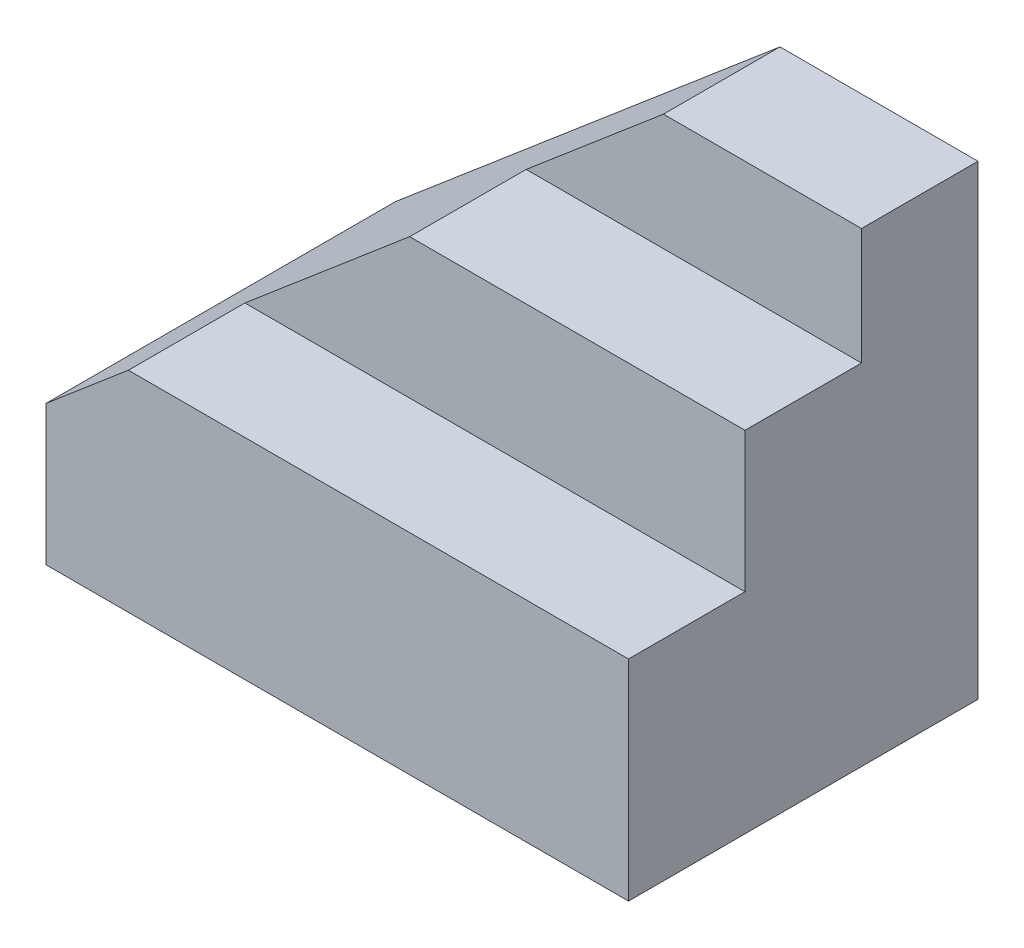
ISO-10303-21;
HEADER;
FILE_DESCRIPTION(('STEP AP214'),'2;1');
FILE_NAME('part.step','',(''),(''),'','','');
FILE_SCHEMA(('AUTOMOTIVE_DESIGN { 1 0 10303 214 1 1 1 1 }'));
ENDSEC;
DATA;
#1=APPLICATION_CONTEXT('core data for automotive mechanical design processes');
#2=APPLICATION_PROTOCOL_DEFINITION('international standard','automotive_design',2000,#1);
#3=PRODUCT_CONTEXT('',#1,'mechanical');
#4=PRODUCT('Part','Part','',(#3));
#5=PRODUCT_RELATED_PRODUCT_CATEGORY('part','',(#4));
#6=PRODUCT_DEFINITION_FORMATION('','',#4);
#7=PRODUCT_DEFINITION_CONTEXT('part definition',#1,'design');
#8=PRODUCT_DEFINITION('design','',#6,#7);
#9=PRODUCT_DEFINITION_SHAPE('','',#8);
#10=(LENGTH_UNIT() NAMED_UNIT(*) SI_UNIT(.MILLI.,.METRE.));
#11=(NAMED_UNIT(*) PLANE_ANGLE_UNIT() SI_UNIT($,.RADIAN.));
#12=(NAMED_UNIT(*) SI_UNIT($,.STERADIAN.) SOLID_ANGLE_UNIT());
#13=UNCERTAINTY_MEASURE_WITH_UNIT(LENGTH_MEASURE(1.E-05),#10,'distance_accuracy_value','');
#14=(GEOMETRIC_REPRESENTATION_CONTEXT(3) GLOBAL_UNCERTAINTY_ASSIGNED_CONTEXT((#13)) GLOBAL_UNIT_ASSIGNED_CONTEXT((#10,
#11,#12)) REPRESENTATION_CONTEXT('',''));
#15=CARTESIAN_POINT('',(0.,0.,0.));
#16=DIRECTION('',(0.,0.,1.));
#17=DIRECTION('',(1.,0.,0.));
#18=AXIS2_PLACEMENT_3D('',#15,#16,#17);
#19=CARTESIAN_POINT('',(0.,0.,40.));
#20=DIRECTION('',(0.,0.,1.));
#21=DIRECTION('',(1.,0.,0.));
#22=AXIS2_PLACEMENT_3D('',#19,#20,#21);
#23=PLANE('',#22);
#24=DIRECTION('',(-0.762509135372792,-0.646977448195096,0.));
#25=VECTOR('',#24,1.);
#26=CARTESIAN_POINT('',(42.4285714285714,60.,40.));
#27=LINE('',#26,#25);
#28=CARTESIAN_POINT('',(42.4285714285714,60.,40.));
#29=VERTEX_POINT('',#28);
#30=CARTESIAN_POINT('',(14.1428571428571,36.,40.));
#31=VERTEX_POINT('',#30);
#32=EDGE_CURVE('E578',#29,#31,#27,.T.);
#33=ORIENTED_EDGE('',*,*,#32,.T.);
#34=DIRECTION('',(-1.,0.,0.));
#35=VECTOR('',#34,1.);
#36=CARTESIAN_POINT('',(100.,36.,40.));
#37=LINE('',#36,#35);
#38=CARTESIAN_POINT('',(100.,36.,40.));
#39=VERTEX_POINT('',#38);
#40=EDGE_CURVE('E393',#39,#31,#37,.T.);
#41=ORIENTED_EDGE('',*,*,#40,.F.);
#42=DIRECTION('',(0.,1.,0.));
#43=VECTOR('',#42,1.);
#44=CARTESIAN_POINT('',(100.,0.,40.));
#45=LINE('',#44,#43);
#46=CARTESIAN_POINT('',(100.,60.,40.));
#47=VERTEX_POINT('',#46);
#48=EDGE_CURVE('E269',#39,#47,#45,.T.);
#49=ORIENTED_EDGE('',*,*,#48,.T.);
#50=DIRECTION('',(-1.,0.,0.));
#51=VECTOR('',#50,1.);
#52=CARTESIAN_POINT('',(100.,60.,40.));
#53=LINE('',#52,#51);
#54=EDGE_CURVE('E682',#47,#29,#53,.T.);
#55=ORIENTED_EDGE('',*,*,#54,.T.);
#56=EDGE_LOOP('',(#33,#41,#49,#55));
#57=FACE_BOUND('',#56,.T.);
#58=ADVANCED_FACE('F75',(#57),#23,.T.);
#59=CARTESIAN_POINT('',(0.,0.,20.));
#60=DIRECTION('',(0.,0.,1.));
#61=DIRECTION('',(1.,0.,0.));
#62=AXIS2_PLACEMENT_3D('',#59,#60,#61);
#63=PLANE('',#62);
#64=DIRECTION('',(-0.762509135372792,-0.646977448195096,0.));
#65=VECTOR('',#64,1.);
#66=CARTESIAN_POINT('',(66.,80.,20.));
#67=LINE('',#66,#65);
#68=CARTESIAN_POINT('',(66.,80.,20.));
#69=VERTEX_POINT('',#68);
#70=CARTESIAN_POINT('',(42.4285714285714,60.,20.));
#71=VERTEX_POINT('',#70);
#72=EDGE_CURVE('E12',#69,#71,#67,.T.);
#73=ORIENTED_EDGE('',*,*,#72,.T.);
#74=DIRECTION('',(-1.,0.,0.));
#75=VECTOR('',#74,1.);
#76=CARTESIAN_POINT('',(100.,60.,20.));
#77=LINE('',#76,#75);
#78=CARTESIAN_POINT('',(100.,60.,20.));
#79=VERTEX_POINT('',#78);
#80=EDGE_CURVE('E453',#79,#71,#77,.T.);
#81=ORIENTED_EDGE('',*,*,#80,.F.);
#82=DIRECTION('',(0.,1.,0.));
#83=VECTOR('',#82,1.);
#84=CARTESIAN_POINT('',(100.,0.,20.));
#85=LINE('',#84,#83);
#86=CARTESIAN_POINT('',(100.,80.,20.));
#87=VERTEX_POINT('',#86);
#88=EDGE_CURVE('E464',#79,#87,#85,.T.);
#89=ORIENTED_EDGE('',*,*,#88,.T.);
#90=DIRECTION('',(-1.,0.,0.));
#91=VECTOR('',#90,1.);
#92=CARTESIAN_POINT('',(100.,80.,20.));
#93=LINE('',#92,#91);
#94=EDGE_CURVE('E87',#87,#69,#93,.T.);
#95=ORIENTED_EDGE('',*,*,#94,.T.);
#96=EDGE_LOOP('',(#73,#81,#89,#95));
#97=FACE_BOUND('',#96,.T.);
#98=ADVANCED_FACE('F77',(#97),#63,.T.);
#99=CARTESIAN_POINT('',(0.,0.,0.));
#100=DIRECTION('',(0.,0.,1.));
#101=DIRECTION('',(1.,0.,0.));
#102=AXIS2_PLACEMENT_3D('',#99,#100,#101);
#103=PLANE('',#102);
#104=DIRECTION('',(0.,-1.,0.));
#105=VECTOR('',#104,1.);
#106=CARTESIAN_POINT('',(0.,24.,0.));
#107=LINE('',#106,#105);
#108=CARTESIAN_POINT('',(0.,24.,0.));
#109=VERTEX_POINT('',#108);
#110=CARTESIAN_POINT('',(0.,0.,0.));
#111=VERTEX_POINT('',#110);
#112=EDGE_CURVE('E562',#109,#111,#107,.T.);
#113=ORIENTED_EDGE('',*,*,#112,.F.);
#114=DIRECTION('',(-0.762509135372792,-0.646977448195096,0.));
#115=VECTOR('',#114,1.);
#116=CARTESIAN_POINT('',(66.,80.,0.));
#117=LINE('',#116,#115);
#118=CARTESIAN_POINT('',(66.,80.,0.));
#119=VERTEX_POINT('',#118);
#120=EDGE_CURVE('E526',#119,#109,#117,.T.);
#121=ORIENTED_EDGE('',*,*,#120,.F.);
#122=DIRECTION('',(-1.,0.,0.));
#123=VECTOR('',#122,1.);
#124=CARTESIAN_POINT('',(100.,80.,0.));
#125=LINE('',#124,#123);
#126=CARTESIAN_POINT('',(100.,80.,0.));
#127=VERTEX_POINT('',#126);
#128=EDGE_CURVE('E539',#127,#119,#125,.T.);
#129=ORIENTED_EDGE('',*,*,#128,.F.);
#130=DIRECTION('',(0.,1.,0.));
#131=VECTOR('',#130,1.);
#132=CARTESIAN_POINT('',(100.,0.,0.));
#133=LINE('',#132,#131);
#134=CARTESIAN_POINT('',(100.,0.,0.));
#135=VERTEX_POINT('',#134);
#136=EDGE_CURVE('E497',#135,#127,#133,.T.);
#137=ORIENTED_EDGE('',*,*,#136,.F.);
#138=DIRECTION('',(1.,0.,0.));
#139=VECTOR('',#138,1.);
#140=CARTESIAN_POINT('',(0.,0.,0.));
#141=LINE('',#140,#139);
#142=EDGE_CURVE('E556',#111,#135,#141,.T.);
#143=ORIENTED_EDGE('',*,*,#142,.F.);
#144=EDGE_LOOP('',(#113,#121,#129,#137,#143));
#145=FACE_BOUND('',#144,.T.);
#146=ADVANCED_FACE('F583',(#145),#103,.F.);
#147=CARTESIAN_POINT('',(0.,0.,0.));
#148=DIRECTION('',(0.,1.,0.));
#149=DIRECTION('',(0.,0.,1.));
#150=AXIS2_PLACEMENT_3D('',#147,#148,#149);
#151=PLANE('',#150);
#152=CARTESIAN_POINT('',(100.,0.,0.));
#153=DIRECTION('',(0.,0.,1.));
#154=VECTOR('',#153,1.);
#155=LINE('',#152,#154);
#156=CARTESIAN_POINT('',(100.,0.,20.));
#157=VERTEX_POINT('',#156);
#158=EDGE_CURVE('E557',#135,#157,#155,.T.);
#159=ORIENTED_EDGE('',*,*,#158,.T.);
#160=CARTESIAN_POINT('',(100.,0.,20.));
#161=DIRECTION('',(0.,0.,1.));
#162=VECTOR('',#161,1.);
#163=LINE('',#160,#162);
#164=CARTESIAN_POINT('',(100.,0.,40.));
#165=VERTEX_POINT('',#164);
#166=EDGE_CURVE('E196',#157,#165,#163,.T.);
#167=ORIENTED_EDGE('',*,*,#166,.T.);
#168=CARTESIAN_POINT('',(100.,0.,40.));
#169=DIRECTION('',(0.,0.,1.));
#170=VECTOR('',#169,1.);
#171=LINE('',#168,#170);
#172=CARTESIAN_POINT('',(100.,0.,60.));
#173=VERTEX_POINT('',#172);
#174=EDGE_CURVE('E188',#165,#173,#171,.T.);
#175=ORIENTED_EDGE('',*,*,#174,.T.);
#176=DIRECTION('',(1.,0.,0.));
#177=VECTOR('',#176,1.);
#178=CARTESIAN_POINT('',(0.,0.,60.));
#179=LINE('',#178,#177);
#180=CARTESIAN_POINT('',(0.,0.,60.));
#181=VERTEX_POINT('',#180);
#182=EDGE_CURVE('E182',#181,#173,#179,.T.);
#183=ORIENTED_EDGE('',*,*,#182,.F.);
#184=CARTESIAN_POINT('',(0.,0.,40.));
#185=DIRECTION('',(0.,0.,1.));
#186=VECTOR('',#185,1.);
#187=LINE('',#184,#186);
#188=CARTESIAN_POINT('',(0.,0.,40.));
#189=VERTEX_POINT('',#188);
#190=EDGE_CURVE('E171',#189,#181,#187,.T.);
#191=ORIENTED_EDGE('',*,*,#190,.F.);
#192=CARTESIAN_POINT('',(0.,0.,20.));
#193=DIRECTION('',(0.,0.,1.));
#194=VECTOR('',#193,1.);
#195=LINE('',#192,#194);
#196=CARTESIAN_POINT('',(0.,0.,20.));
#197=VERTEX_POINT('',#196);
#198=EDGE_CURVE('E177',#197,#189,#195,.T.);
#199=ORIENTED_EDGE('',*,*,#198,.F.);
#200=CARTESIAN_POINT('',(0.,0.,0.));
#201=DIRECTION('',(0.,0.,1.));
#202=VECTOR('',#201,1.);
#203=LINE('',#200,#202);
#204=EDGE_CURVE('E194',#111,#197,#203,.T.);
#205=ORIENTED_EDGE('',*,*,#204,.F.);
#206=ORIENTED_EDGE('',*,*,#142,.T.);
#207=EDGE_LOOP('',(#159,#167,#175,#183,#191,#199,#205,#206));
#208=FACE_BOUND('',#207,.T.);
#209=ADVANCED_FACE('F175',(#208),#151,.F.);
#210=CARTESIAN_POINT('',(0.,0.,0.));
#211=DIRECTION('',(1.,0.,0.));
#212=DIRECTION('',(0.,0.,-1.));
#213=AXIS2_PLACEMENT_3D('',#210,#211,#212);
#214=PLANE('',#213);
#215=ORIENTED_EDGE('',*,*,#204,.T.);
#216=ORIENTED_EDGE('',*,*,#198,.T.);
#217=ORIENTED_EDGE('',*,*,#190,.T.);
#218=DIRECTION('',(0.,-1.,0.));
#219=VECTOR('',#218,1.);
#220=CARTESIAN_POINT('',(0.,24.,60.));
#221=LINE('',#220,#219);
#222=CARTESIAN_POINT('',(0.,24.,60.));
#223=VERTEX_POINT('',#222);
#224=EDGE_CURVE('E259',#223,#181,#221,.T.);
#225=ORIENTED_EDGE('',*,*,#224,.F.);
#226=CARTESIAN_POINT('',(0.,24.,40.));
#227=DIRECTION('',(0.,0.,1.));
#228=VECTOR('',#227,1.);
#229=LINE('',#226,#228);
#230=CARTESIAN_POINT('',(0.,24.,40.));
#231=VERTEX_POINT('',#230);
#232=EDGE_CURVE('E255',#231,#223,#229,.T.);
#233=ORIENTED_EDGE('',*,*,#232,.F.);
#234=CARTESIAN_POINT('',(0.,24.,20.));
#235=DIRECTION('',(0.,0.,1.));
#236=VECTOR('',#235,1.);
#237=LINE('',#234,#236);
#238=CARTESIAN_POINT('',(0.,24.,20.));
#239=VERTEX_POINT('',#238);
#240=EDGE_CURVE('E257',#239,#231,#237,.T.);
#241=ORIENTED_EDGE('',*,*,#240,.F.);
#242=CARTESIAN_POINT('',(0.,24.,0.));
#243=DIRECTION('',(0.,0.,1.));
#244=VECTOR('',#243,1.);
#245=LINE('',#242,#244);
#246=EDGE_CURVE('E267',#109,#239,#245,.T.);
#247=ORIENTED_EDGE('',*,*,#246,.F.);
#248=ORIENTED_EDGE('',*,*,#112,.T.);
#249=EDGE_LOOP('',(#215,#216,#217,#225,#233,#241,#247,#248));
#250=FACE_BOUND('',#249,.T.);
#251=ADVANCED_FACE('F192',(#250),#214,.F.);
#252=CARTESIAN_POINT('',(100.,0.,0.));
#253=DIRECTION('',(-1.,0.,0.));
#254=DIRECTION('',(0.,0.,1.));
#255=AXIS2_PLACEMENT_3D('',#252,#253,#254);
#256=PLANE('',#255);
#257=CARTESIAN_POINT('',(100.,80.,0.));
#258=DIRECTION('',(0.,0.,1.));
#259=VECTOR('',#258,1.);
#260=LINE('',#257,#259);
#261=EDGE_CURVE('E487',#127,#87,#260,.T.);
#262=ORIENTED_EDGE('',*,*,#261,.T.);
#263=ORIENTED_EDGE('',*,*,#88,.F.);
#264=CARTESIAN_POINT('',(100.,60.,20.));
#265=DIRECTION('',(0.,0.,1.));
#266=VECTOR('',#265,1.);
#267=LINE('',#264,#266);
#268=EDGE_CURVE('E104',#79,#47,#267,.T.);
#269=ORIENTED_EDGE('',*,*,#268,.T.);
#270=ORIENTED_EDGE('',*,*,#48,.F.);
#271=CARTESIAN_POINT('',(100.,36.,40.));
#272=DIRECTION('',(0.,0.,1.));
#273=VECTOR('',#272,1.);
#274=LINE('',#271,#273);
#275=CARTESIAN_POINT('',(100.,36.,60.));
#276=VERTEX_POINT('',#275);
#277=EDGE_CURVE('E95',#39,#276,#274,.T.);
#278=ORIENTED_EDGE('',*,*,#277,.T.);
#279=DIRECTION('',(0.,1.,0.));
#280=VECTOR('',#279,1.);
#281=CARTESIAN_POINT('',(100.,0.,60.));
#282=LINE('',#281,#280);
#283=EDGE_CURVE('E358',#173,#276,#282,.T.);
#284=ORIENTED_EDGE('',*,*,#283,.F.);
#285=ORIENTED_EDGE('',*,*,#174,.F.);
#286=ORIENTED_EDGE('',*,*,#166,.F.);
#287=ORIENTED_EDGE('',*,*,#158,.F.);
#288=ORIENTED_EDGE('',*,*,#136,.T.);
#289=EDGE_LOOP('',(#262,#263,#269,#270,#278,#284,#285,#286,#287,#288));
#290=FACE_BOUND('',#289,.T.);
#291=ADVANCED_FACE('F214',(#290),#256,.F.);
#292=CARTESIAN_POINT('',(0.,80.,0.));
#293=DIRECTION('',(0.,-1.,0.));
#294=DIRECTION('',(0.,0.,-1.));
#295=AXIS2_PLACEMENT_3D('',#292,#293,#294);
#296=PLANE('',#295);
#297=CARTESIAN_POINT('',(66.,80.,0.));
#298=DIRECTION('',(0.,0.,1.));
#299=VECTOR('',#298,1.);
#300=LINE('',#297,#299);
#301=EDGE_CURVE('E490',#119,#69,#300,.T.);
#302=ORIENTED_EDGE('',*,*,#301,.T.);
#303=ORIENTED_EDGE('',*,*,#94,.F.);
#304=ORIENTED_EDGE('',*,*,#261,.F.);
#305=ORIENTED_EDGE('',*,*,#128,.T.);
#306=EDGE_LOOP('',(#302,#303,#304,#305));
#307=FACE_BOUND('',#306,.T.);
#308=ADVANCED_FACE('F287',(#307),#296,.F.);
#309=CARTESIAN_POINT('',(-11.8398291510945,13.9540843566471,0.));
#310=DIRECTION('',(0.646977448195096,-0.762509135372792,0.));
#311=DIRECTION('',(0.762509135372792,0.646977448195096,0.));
#312=AXIS2_PLACEMENT_3D('',#309,#310,#311);
#313=PLANE('',#312);
#314=ORIENTED_EDGE('',*,*,#246,.T.);
#315=ORIENTED_EDGE('',*,*,#240,.T.);
#316=ORIENTED_EDGE('',*,*,#232,.T.);
#317=DIRECTION('',(-0.762509135372792,-0.646977448195096,0.));
#318=VECTOR('',#317,1.);
#319=CARTESIAN_POINT('',(14.1428571428571,36.,60.));
#320=LINE('',#319,#318);
#321=CARTESIAN_POINT('',(14.1428571428571,36.,60.));
#322=VERTEX_POINT('',#321);
#323=EDGE_CURVE('E448',#322,#223,#320,.T.);
#324=ORIENTED_EDGE('',*,*,#323,.F.);
#325=CARTESIAN_POINT('',(14.1428571428571,36.,40.));
#326=DIRECTION('',(0.,0.,1.));
#327=VECTOR('',#326,1.);
#328=LINE('',#325,#327);
#329=EDGE_CURVE('E263',#31,#322,#328,.T.);
#330=ORIENTED_EDGE('',*,*,#329,.F.);
#331=ORIENTED_EDGE('',*,*,#32,.F.);
#332=CARTESIAN_POINT('',(42.4285714285714,60.,20.));
#333=DIRECTION('',(0.,0.,1.));
#334=VECTOR('',#333,1.);
#335=LINE('',#332,#334);
#336=EDGE_CURVE('E270',#71,#29,#335,.T.);
#337=ORIENTED_EDGE('',*,*,#336,.F.);
#338=ORIENTED_EDGE('',*,*,#72,.F.);
#339=ORIENTED_EDGE('',*,*,#301,.F.);
#340=ORIENTED_EDGE('',*,*,#120,.T.);
#341=EDGE_LOOP('',(#314,#315,#316,#324,#330,#331,#337,#338,#339,#340));
#342=FACE_BOUND('',#341,.T.);
#343=ADVANCED_FACE('F265',(#342),#313,.F.);
#344=CARTESIAN_POINT('',(0.,60.,0.));
#345=DIRECTION('',(0.,-1.,0.));
#346=DIRECTION('',(0.,0.,-1.));
#347=AXIS2_PLACEMENT_3D('',#344,#345,#346);
#348=PLANE('',#347);
#349=ORIENTED_EDGE('',*,*,#336,.T.);
#350=ORIENTED_EDGE('',*,*,#54,.F.);
#351=ORIENTED_EDGE('',*,*,#268,.F.);
#352=ORIENTED_EDGE('',*,*,#80,.T.);
#353=EDGE_LOOP('',(#349,#350,#351,#352));
#354=FACE_BOUND('',#353,.T.);
#355=ADVANCED_FACE('F286',(#354),#348,.F.);
#356=CARTESIAN_POINT('',(0.,0.,60.));
#357=DIRECTION('',(0.,0.,1.));
#358=DIRECTION('',(1.,0.,0.));
#359=AXIS2_PLACEMENT_3D('',#356,#357,#358);
#360=PLANE('',#359);
#361=ORIENTED_EDGE('',*,*,#224,.T.);
#362=ORIENTED_EDGE('',*,*,#182,.T.);
#363=ORIENTED_EDGE('',*,*,#283,.T.);
#364=DIRECTION('',(-1.,0.,0.));
#365=VECTOR('',#364,1.);
#366=CARTESIAN_POINT('',(100.,36.,60.));
#367=LINE('',#366,#365);
#368=EDGE_CURVE('E445',#276,#322,#367,.T.);
#369=ORIENTED_EDGE('',*,*,#368,.T.);
#370=ORIENTED_EDGE('',*,*,#323,.T.);
#371=EDGE_LOOP('',(#361,#362,#363,#369,#370));
#372=FACE_BOUND('',#371,.T.);
#373=ADVANCED_FACE('F396',(#372),#360,.T.);
#374=CARTESIAN_POINT('',(0.,36.,0.));
#375=DIRECTION('',(0.,-1.,0.));
#376=DIRECTION('',(0.,0.,-1.));
#377=AXIS2_PLACEMENT_3D('',#374,#375,#376);
#378=PLANE('',#377);
#379=ORIENTED_EDGE('',*,*,#329,.T.);
#380=ORIENTED_EDGE('',*,*,#368,.F.);
#381=ORIENTED_EDGE('',*,*,#277,.F.);
#382=ORIENTED_EDGE('',*,*,#40,.T.);
#383=EDGE_LOOP('',(#379,#380,#381,#382));
#384=FACE_BOUND('',#383,.T.);
#385=ADVANCED_FACE('F417',(#384),#378,.F.);
#386=CLOSED_SHELL('',(#58,#98,#146,#209,#251,#291,#308,#343,#355,#373,#385));
#387=MANIFOLD_SOLID_BREP('B2',#386);
#388=ADVANCED_BREP_SHAPE_REPRESENTATION('',(#18,#387),#14);
#389=SHAPE_DEFINITION_REPRESENTATION(#9,#388);
ENDSEC;
END-ISO-10303-21;
